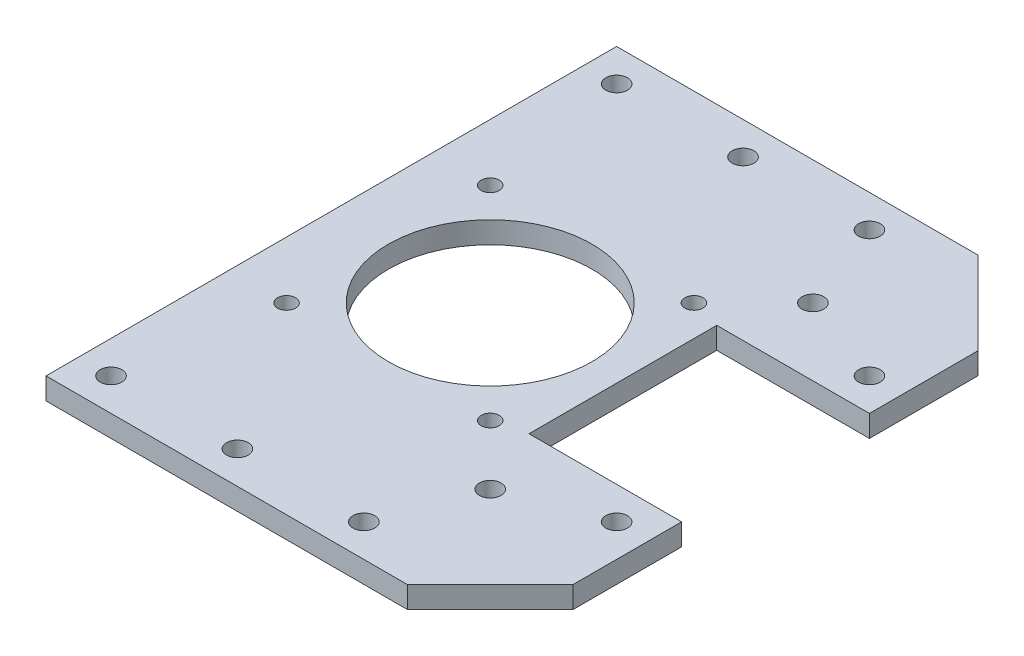
ISO-10303-21;
HEADER;
FILE_DESCRIPTION(('STEP AP214'),'2;1');
FILE_NAME('part.step','',(''),(''),'','','');
FILE_SCHEMA(('AUTOMOTIVE_DESIGN { 1 0 10303 214 1 1 1 1 }'));
ENDSEC;
DATA;
#1=APPLICATION_CONTEXT('core data for automotive mechanical design processes');
#2=APPLICATION_PROTOCOL_DEFINITION('international standard','automotive_design',2000,#1);
#3=PRODUCT_CONTEXT('',#1,'mechanical');
#4=PRODUCT('Part','Part','',(#3));
#5=PRODUCT_RELATED_PRODUCT_CATEGORY('part','',(#4));
#6=PRODUCT_DEFINITION_FORMATION('','',#4);
#7=PRODUCT_DEFINITION_CONTEXT('part definition',#1,'design');
#8=PRODUCT_DEFINITION('design','',#6,#7);
#9=PRODUCT_DEFINITION_SHAPE('','',#8);
#10=(LENGTH_UNIT() NAMED_UNIT(*) SI_UNIT(.MILLI.,.METRE.));
#11=(NAMED_UNIT(*) PLANE_ANGLE_UNIT() SI_UNIT($,.RADIAN.));
#12=(NAMED_UNIT(*) SI_UNIT($,.STERADIAN.) SOLID_ANGLE_UNIT());
#13=UNCERTAINTY_MEASURE_WITH_UNIT(LENGTH_MEASURE(1.E-05),#10,'distance_accuracy_value','');
#14=(GEOMETRIC_REPRESENTATION_CONTEXT(3) GLOBAL_UNCERTAINTY_ASSIGNED_CONTEXT((#13)) GLOBAL_UNIT_ASSIGNED_CONTEXT((#10,
#11,#12)) REPRESENTATION_CONTEXT('',''));
#15=CARTESIAN_POINT('',(0.,0.,0.));
#16=DIRECTION('',(0.,0.,1.));
#17=DIRECTION('',(1.,0.,0.));
#18=AXIS2_PLACEMENT_3D('',#15,#16,#17);
#19=CARTESIAN_POINT('',(0.,3.,0.));
#20=DIRECTION('',(0.,1.,0.));
#21=DIRECTION('',(0.,0.,1.));
#22=AXIS2_PLACEMENT_3D('',#19,#20,#21);
#23=PLANE('',#22);
#24=CARTESIAN_POINT('',(-14.1,3.,-14.1));
#25=DIRECTION('',(0.,1.,0.));
#26=DIRECTION('',(0.,0.,1.));
#27=AXIS2_PLACEMENT_3D('',#24,#25,#26);
#28=CIRCLE('',#27,1.25);
#29=CARTESIAN_POINT('',(-14.1,3.,-12.85));
#30=VERTEX_POINT('',#29);
#31=EDGE_CURVE('E292',#30,#30,#28,.T.);
#32=ORIENTED_EDGE('',*,*,#31,.F.);
#33=EDGE_LOOP('',(#32));
#34=FACE_BOUND('',#33,.T.);
#35=CARTESIAN_POINT('',(22.3377201986492,3.,22.3377201986492));
#36=DIRECTION('',(0.,1.,0.));
#37=DIRECTION('',(0.,0.,1.));
#38=AXIS2_PLACEMENT_3D('',#35,#36,#37);
#39=CIRCLE('',#38,1.5);
#40=CARTESIAN_POINT('',(22.3377201986492,3.,23.8377201986492));
#41=VERTEX_POINT('',#40);
#42=EDGE_CURVE('E280',#41,#41,#39,.T.);
#43=ORIENTED_EDGE('',*,*,#42,.F.);
#44=EDGE_LOOP('',(#43));
#45=FACE_BOUND('',#44,.T.);
#46=CARTESIAN_POINT('',(35.,3.,-17.5));
#47=DIRECTION('',(0.,1.,0.));
#48=DIRECTION('',(0.,0.,1.));
#49=AXIS2_PLACEMENT_3D('',#46,#47,#48);
#50=CIRCLE('',#49,1.5);
#51=CARTESIAN_POINT('',(35.,3.,-16.));
#52=VERTEX_POINT('',#51);
#53=EDGE_CURVE('E268',#52,#52,#50,.T.);
#54=ORIENTED_EDGE('',*,*,#53,.F.);
#55=EDGE_LOOP('',(#54));
#56=FACE_BOUND('',#55,.T.);
#57=CARTESIAN_POINT('',(17.5,3.,-35.));
#58=DIRECTION('',(0.,1.,0.));
#59=DIRECTION('',(0.,0.,1.));
#60=AXIS2_PLACEMENT_3D('',#57,#58,#59);
#61=CIRCLE('',#60,1.5);
#62=CARTESIAN_POINT('',(17.5,3.,-33.5));
#63=VERTEX_POINT('',#62);
#64=EDGE_CURVE('E256',#63,#63,#61,.T.);
#65=ORIENTED_EDGE('',*,*,#64,.F.);
#66=EDGE_LOOP('',(#65));
#67=FACE_BOUND('',#66,.T.);
#68=CARTESIAN_POINT('',(14.1,3.,-14.1));
#69=DIRECTION('',(0.,1.,0.));
#70=DIRECTION('',(0.,0.,1.));
#71=AXIS2_PLACEMENT_3D('',#68,#69,#70);
#72=CIRCLE('',#71,1.25);
#73=CARTESIAN_POINT('',(14.1,3.,-12.85));
#74=VERTEX_POINT('',#73);
#75=EDGE_CURVE('E244',#74,#74,#72,.T.);
#76=ORIENTED_EDGE('',*,*,#75,.F.);
#77=EDGE_LOOP('',(#76));
#78=FACE_BOUND('',#77,.T.);
#79=CARTESIAN_POINT('',(0.,3.,-34.9999999999999));
#80=DIRECTION('',(0.,1.,0.));
#81=DIRECTION('',(0.,0.,1.));
#82=AXIS2_PLACEMENT_3D('',#79,#80,#81);
#83=CIRCLE('',#82,1.5);
#84=CARTESIAN_POINT('',(0.,3.,-33.4999999999999));
#85=VERTEX_POINT('',#84);
#86=EDGE_CURVE('E232',#85,#85,#83,.T.);
#87=ORIENTED_EDGE('',*,*,#86,.F.);
#88=EDGE_LOOP('',(#87));
#89=FACE_BOUND('',#88,.T.);
#90=CARTESIAN_POINT('',(1.2490009027033E-13,3.,34.9999999999999));
#91=DIRECTION('',(0.,1.,0.));
#92=DIRECTION('',(0.,0.,-1.));
#93=AXIS2_PLACEMENT_3D('',#90,#91,#92);
#94=CIRCLE('',#93,1.49999999999987);
#95=CARTESIAN_POINT('',(1.2490009027033E-13,3.,33.5));
#96=VERTEX_POINT('',#95);
#97=EDGE_CURVE('E220',#96,#96,#94,.T.);
#98=ORIENTED_EDGE('',*,*,#97,.F.);
#99=EDGE_LOOP('',(#98));
#100=FACE_BOUND('',#99,.T.);
#101=DIRECTION('',(0.,0.,-1.));
#102=VECTOR('',#101,1.);
#103=CARTESIAN_POINT('',(39.5000000000003,3.,-13.0000000000003));
#104=LINE('',#103,#102);
#105=CARTESIAN_POINT('',(39.5000000000003,3.,-13.0000000000003));
#106=VERTEX_POINT('',#105);
#107=CARTESIAN_POINT('',(39.5000000000002,3.,-28.0315247468661));
#108=VERTEX_POINT('',#107);
#109=EDGE_CURVE('E170',#106,#108,#104,.T.);
#110=ORIENTED_EDGE('',*,*,#109,.T.);
#111=DIRECTION('',(-0.707106781186549,0.,-0.707106781186546));
#112=VECTOR('',#111,1.);
#113=CARTESIAN_POINT('',(39.5000000000002,3.,-28.0315247468661));
#114=LINE('',#113,#112);
#115=CARTESIAN_POINT('',(28.031524746866,3.,-39.5000000000003));
#116=VERTEX_POINT('',#115);
#117=EDGE_CURVE('E107',#108,#116,#114,.T.);
#118=ORIENTED_EDGE('',*,*,#117,.T.);
#119=DIRECTION('',(-1.,0.,0.));
#120=VECTOR('',#119,1.);
#121=CARTESIAN_POINT('',(28.031524746866,3.,-39.5000000000003));
#122=LINE('',#121,#120);
#123=CARTESIAN_POINT('',(-21.9999999999998,3.,-39.5000000000002));
#124=VERTEX_POINT('',#123);
#125=EDGE_CURVE('E191',#116,#124,#122,.T.);
#126=ORIENTED_EDGE('',*,*,#125,.T.);
#127=DIRECTION('',(0.,0.,1.));
#128=VECTOR('',#127,1.);
#129=CARTESIAN_POINT('',(-21.9999999999998,3.,-39.5000000000002));
#130=LINE('',#129,#128);
#131=CARTESIAN_POINT('',(-21.9999999999997,3.,39.4999999999998));
#132=VERTEX_POINT('',#131);
#133=EDGE_CURVE('E209',#124,#132,#130,.T.);
#134=ORIENTED_EDGE('',*,*,#133,.T.);
#135=DIRECTION('',(1.,0.,0.));
#136=VECTOR('',#135,1.);
#137=CARTESIAN_POINT('',(-21.9999999999997,3.,39.4999999999998));
#138=LINE('',#137,#136);
#139=CARTESIAN_POINT('',(28.031524746866,3.,39.4999999999998));
#140=VERTEX_POINT('',#139);
#141=EDGE_CURVE('E206',#132,#140,#138,.T.);
#142=ORIENTED_EDGE('',*,*,#141,.T.);
#143=DIRECTION('',(0.707106781186547,0.,-0.707106781186548));
#144=VECTOR('',#143,1.);
#145=CARTESIAN_POINT('',(28.031524746866,3.,39.4999999999998));
#146=LINE('',#145,#144);
#147=CARTESIAN_POINT('',(39.5000000000003,3.,28.0315247468655));
#148=VERTEX_POINT('',#147);
#149=EDGE_CURVE('E208',#140,#148,#146,.T.);
#150=ORIENTED_EDGE('',*,*,#149,.T.);
#151=DIRECTION('',(0.,0.,-1.));
#152=VECTOR('',#151,1.);
#153=CARTESIAN_POINT('',(39.5000000000003,3.,28.0315247468655));
#154=LINE('',#153,#152);
#155=CARTESIAN_POINT('',(39.5000000000003,3.,12.9999999999997));
#156=VERTEX_POINT('',#155);
#157=EDGE_CURVE('E132',#148,#156,#154,.T.);
#158=ORIENTED_EDGE('',*,*,#157,.T.);
#159=DIRECTION('',(-1.,0.,0.));
#160=VECTOR('',#159,1.);
#161=CARTESIAN_POINT('',(18.3705497837258,3.,12.9999999999997));
#162=LINE('',#161,#160);
#163=CARTESIAN_POINT('',(18.3705497837258,3.,12.9999999999997));
#164=VERTEX_POINT('',#163);
#165=EDGE_CURVE('E126',#156,#164,#162,.T.);
#166=ORIENTED_EDGE('',*,*,#165,.T.);
#167=DIRECTION('',(0.,0.,-1.));
#168=VECTOR('',#167,1.);
#169=CARTESIAN_POINT('',(18.3705497837256,3.,-12.9912624730496));
#170=LINE('',#169,#168);
#171=CARTESIAN_POINT('',(18.3705497837256,3.,-12.9912624730496));
#172=VERTEX_POINT('',#171);
#173=EDGE_CURVE('E130',#164,#172,#170,.T.);
#174=ORIENTED_EDGE('',*,*,#173,.T.);
#175=DIRECTION('',(0.999999914499115,0.,-0.000413523594520642));
#176=VECTOR('',#175,1.);
#177=CARTESIAN_POINT('',(39.5000000000003,3.,-13.0000000000003));
#178=LINE('',#177,#176);
#179=EDGE_CURVE('E58',#172,#106,#178,.T.);
#180=ORIENTED_EDGE('',*,*,#179,.T.);
#181=EDGE_LOOP('',(#110,#118,#126,#134,#142,#150,#158,#166,#174,#180));
#182=FACE_BOUND('',#181,.T.);
#183=CARTESIAN_POINT('',(-14.1,3.,14.1));
#184=DIRECTION('',(0.,1.,0.));
#185=DIRECTION('',(0.,0.,1.));
#186=AXIS2_PLACEMENT_3D('',#183,#184,#185);
#187=CIRCLE('',#186,1.25);
#188=CARTESIAN_POINT('',(-14.1,3.,15.35));
#189=VERTEX_POINT('',#188);
#190=EDGE_CURVE('E154',#189,#189,#187,.T.);
#191=ORIENTED_EDGE('',*,*,#190,.F.);
#192=EDGE_LOOP('',(#191));
#193=FACE_BOUND('',#192,.T.);
#194=CARTESIAN_POINT('',(-17.4999999999999,3.,34.9999999999998));
#195=DIRECTION('',(0.,1.,0.));
#196=DIRECTION('',(0.,0.,-1.));
#197=AXIS2_PLACEMENT_3D('',#194,#195,#196);
#198=CIRCLE('',#197,1.49999999999987);
#199=CARTESIAN_POINT('',(-17.4999999999999,3.,33.4999999999999));
#200=VERTEX_POINT('',#199);
#201=EDGE_CURVE('E226',#200,#200,#198,.T.);
#202=ORIENTED_EDGE('',*,*,#201,.F.);
#203=EDGE_LOOP('',(#202));
#204=FACE_BOUND('',#203,.T.);
#205=CARTESIAN_POINT('',(-17.5,3.,-34.9999999999998));
#206=DIRECTION('',(0.,1.,0.));
#207=DIRECTION('',(0.,0.,1.));
#208=AXIS2_PLACEMENT_3D('',#205,#206,#207);
#209=CIRCLE('',#208,1.5);
#210=CARTESIAN_POINT('',(-17.5,3.,-33.4999999999998));
#211=VERTEX_POINT('',#210);
#212=EDGE_CURVE('E238',#211,#211,#209,.T.);
#213=ORIENTED_EDGE('',*,*,#212,.F.);
#214=EDGE_LOOP('',(#213));
#215=FACE_BOUND('',#214,.T.);
#216=CARTESIAN_POINT('',(0.,3.,0.));
#217=DIRECTION('',(0.,1.,0.));
#218=DIRECTION('',(0.,0.,1.));
#219=AXIS2_PLACEMENT_3D('',#216,#217,#218);
#220=CIRCLE('',#219,14.1);
#221=CARTESIAN_POINT('',(0.,3.,14.1));
#222=VERTEX_POINT('',#221);
#223=EDGE_CURVE('E250',#222,#222,#220,.T.);
#224=ORIENTED_EDGE('',*,*,#223,.F.);
#225=EDGE_LOOP('',(#224));
#226=FACE_BOUND('',#225,.T.);
#227=CARTESIAN_POINT('',(22.3377201986492,3.,-22.3377201986493));
#228=DIRECTION('',(0.,1.,0.));
#229=DIRECTION('',(0.,0.,1.));
#230=AXIS2_PLACEMENT_3D('',#227,#228,#229);
#231=CIRCLE('',#230,1.5);
#232=CARTESIAN_POINT('',(22.3377201986492,3.,-20.8377201986493));
#233=VERTEX_POINT('',#232);
#234=EDGE_CURVE('E262',#233,#233,#231,.T.);
#235=ORIENTED_EDGE('',*,*,#234,.F.);
#236=EDGE_LOOP('',(#235));
#237=FACE_BOUND('',#236,.T.);
#238=CARTESIAN_POINT('',(17.5,3.,35.));
#239=DIRECTION('',(0.,1.,0.));
#240=DIRECTION('',(0.,0.,1.));
#241=AXIS2_PLACEMENT_3D('',#238,#239,#240);
#242=CIRCLE('',#241,1.5);
#243=CARTESIAN_POINT('',(17.5,3.,36.5));
#244=VERTEX_POINT('',#243);
#245=EDGE_CURVE('E274',#244,#244,#242,.T.);
#246=ORIENTED_EDGE('',*,*,#245,.F.);
#247=EDGE_LOOP('',(#246));
#248=FACE_BOUND('',#247,.T.);
#249=CARTESIAN_POINT('',(35.,3.,17.5));
#250=DIRECTION('',(0.,1.,0.));
#251=DIRECTION('',(0.,0.,1.));
#252=AXIS2_PLACEMENT_3D('',#249,#250,#251);
#253=CIRCLE('',#252,1.5);
#254=CARTESIAN_POINT('',(35.,3.,19.));
#255=VERTEX_POINT('',#254);
#256=EDGE_CURVE('E286',#255,#255,#253,.T.);
#257=ORIENTED_EDGE('',*,*,#256,.F.);
#258=EDGE_LOOP('',(#257));
#259=FACE_BOUND('',#258,.T.);
#260=CARTESIAN_POINT('',(14.1,3.,14.1));
#261=DIRECTION('',(0.,1.,0.));
#262=DIRECTION('',(0.,0.,1.));
#263=AXIS2_PLACEMENT_3D('',#260,#261,#262);
#264=CIRCLE('',#263,1.25);
#265=CARTESIAN_POINT('',(14.1,3.,15.35));
#266=VERTEX_POINT('',#265);
#267=EDGE_CURVE('E298',#266,#266,#264,.T.);
#268=ORIENTED_EDGE('',*,*,#267,.F.);
#269=EDGE_LOOP('',(#268));
#270=FACE_BOUND('',#269,.T.);
#271=ADVANCED_FACE('F41',(#34,#45,#56,#67,#78,#89,#100,#182,#193,#204,#215,#226,#237,#248,#259,
#270),#23,.T.);
#272=CARTESIAN_POINT('',(0.,0.,0.));
#273=DIRECTION('',(0.,1.,0.));
#274=DIRECTION('',(0.,0.,1.));
#275=AXIS2_PLACEMENT_3D('',#272,#273,#274);
#276=PLANE('',#275);
#277=DIRECTION('',(0.,0.,-1.));
#278=VECTOR('',#277,1.);
#279=CARTESIAN_POINT('',(39.5000000000003,0.,-13.0000000000003));
#280=LINE('',#279,#278);
#281=CARTESIAN_POINT('',(39.5000000000003,0.,-13.0000000000003));
#282=VERTEX_POINT('',#281);
#283=CARTESIAN_POINT('',(39.5000000000002,0.,-28.0315247468661));
#284=VERTEX_POINT('',#283);
#285=EDGE_CURVE('E150',#282,#284,#280,.T.);
#286=ORIENTED_EDGE('',*,*,#285,.F.);
#287=DIRECTION('',(0.999999914499115,0.,-0.000413523594520642));
#288=VECTOR('',#287,1.);
#289=CARTESIAN_POINT('',(39.5000000000003,0.,-13.0000000000003));
#290=LINE('',#289,#288);
#291=CARTESIAN_POINT('',(18.3705497837256,0.,-12.9912624730496));
#292=VERTEX_POINT('',#291);
#293=EDGE_CURVE('E99',#292,#282,#290,.T.);
#294=ORIENTED_EDGE('',*,*,#293,.F.);
#295=DIRECTION('',(0.,0.,-1.));
#296=VECTOR('',#295,1.);
#297=CARTESIAN_POINT('',(18.3705497837256,0.,-12.9912624730496));
#298=LINE('',#297,#296);
#299=CARTESIAN_POINT('',(18.3705497837258,0.,12.9999999999997));
#300=VERTEX_POINT('',#299);
#301=EDGE_CURVE('E93',#300,#292,#298,.T.);
#302=ORIENTED_EDGE('',*,*,#301,.F.);
#303=DIRECTION('',(-1.,0.,0.));
#304=VECTOR('',#303,1.);
#305=CARTESIAN_POINT('',(18.3705497837258,0.,12.9999999999997));
#306=LINE('',#305,#304);
#307=CARTESIAN_POINT('',(39.5000000000003,0.,12.9999999999997));
#308=VERTEX_POINT('',#307);
#309=EDGE_CURVE('E140',#308,#300,#306,.T.);
#310=ORIENTED_EDGE('',*,*,#309,.F.);
#311=DIRECTION('',(0.,0.,-1.));
#312=VECTOR('',#311,1.);
#313=CARTESIAN_POINT('',(39.5000000000003,0.,28.0315247468655));
#314=LINE('',#313,#312);
#315=CARTESIAN_POINT('',(39.5000000000003,0.,28.0315247468655));
#316=VERTEX_POINT('',#315);
#317=EDGE_CURVE('E165',#316,#308,#314,.T.);
#318=ORIENTED_EDGE('',*,*,#317,.F.);
#319=DIRECTION('',(0.707106781186547,0.,-0.707106781186548));
#320=VECTOR('',#319,1.);
#321=CARTESIAN_POINT('',(28.031524746866,0.,39.4999999999998));
#322=LINE('',#321,#320);
#323=CARTESIAN_POINT('',(28.031524746866,0.,39.4999999999998));
#324=VERTEX_POINT('',#323);
#325=EDGE_CURVE('E163',#324,#316,#322,.T.);
#326=ORIENTED_EDGE('',*,*,#325,.F.);
#327=DIRECTION('',(1.,0.,0.));
#328=VECTOR('',#327,1.);
#329=CARTESIAN_POINT('',(-21.9999999999997,0.,39.4999999999998));
#330=LINE('',#329,#328);
#331=CARTESIAN_POINT('',(-21.9999999999997,0.,39.4999999999998));
#332=VERTEX_POINT('',#331);
#333=EDGE_CURVE('E161',#332,#324,#330,.T.);
#334=ORIENTED_EDGE('',*,*,#333,.F.);
#335=DIRECTION('',(0.,0.,1.));
#336=VECTOR('',#335,1.);
#337=CARTESIAN_POINT('',(-21.9999999999998,0.,-30.5000000000002));
#338=LINE('',#337,#336);
#339=CARTESIAN_POINT('',(-21.9999999999998,0.,-39.5000000000002));
#340=VERTEX_POINT('',#339);
#341=EDGE_CURVE('E159',#340,#332,#338,.T.);
#342=ORIENTED_EDGE('',*,*,#341,.F.);
#343=DIRECTION('',(-1.,0.,0.));
#344=VECTOR('',#343,1.);
#345=CARTESIAN_POINT('',(28.031524746866,0.,-39.5000000000003));
#346=LINE('',#345,#344);
#347=CARTESIAN_POINT('',(28.031524746866,0.,-39.5000000000003));
#348=VERTEX_POINT('',#347);
#349=EDGE_CURVE('E156',#348,#340,#346,.T.);
#350=ORIENTED_EDGE('',*,*,#349,.F.);
#351=DIRECTION('',(-0.707106781186549,0.,-0.707106781186546));
#352=VECTOR('',#351,1.);
#353=CARTESIAN_POINT('',(39.5000000000002,0.,-28.0315247468661));
#354=LINE('',#353,#352);
#355=EDGE_CURVE('E153',#284,#348,#354,.T.);
#356=ORIENTED_EDGE('',*,*,#355,.F.);
#357=EDGE_LOOP('',(#286,#294,#302,#310,#318,#326,#334,#342,#350,#356));
#358=FACE_BOUND('',#357,.T.);
#359=CARTESIAN_POINT('',(-14.1,0.,14.1));
#360=DIRECTION('',(0.,1.,0.));
#361=DIRECTION('',(0.,0.,1.));
#362=AXIS2_PLACEMENT_3D('',#359,#360,#361);
#363=CIRCLE('',#362,1.25);
#364=CARTESIAN_POINT('',(-14.1,0.,15.35));
#365=VERTEX_POINT('',#364);
#366=EDGE_CURVE('E217',#365,#365,#363,.T.);
#367=ORIENTED_EDGE('',*,*,#366,.T.);
#368=EDGE_LOOP('',(#367));
#369=FACE_BOUND('',#368,.T.);
#370=CARTESIAN_POINT('',(1.2490009027033E-13,0.,34.9999999999999));
#371=DIRECTION('',(0.,1.,0.));
#372=DIRECTION('',(0.,0.,-1.));
#373=AXIS2_PLACEMENT_3D('',#370,#371,#372);
#374=CIRCLE('',#373,1.49999999999987);
#375=CARTESIAN_POINT('',(1.2490009027033E-13,0.,33.5));
#376=VERTEX_POINT('',#375);
#377=EDGE_CURVE('E223',#376,#376,#374,.T.);
#378=ORIENTED_EDGE('',*,*,#377,.T.);
#379=EDGE_LOOP('',(#378));
#380=FACE_BOUND('',#379,.T.);
#381=CARTESIAN_POINT('',(-17.4999999999999,0.,34.9999999999998));
#382=DIRECTION('',(0.,1.,0.));
#383=DIRECTION('',(0.,0.,-1.));
#384=AXIS2_PLACEMENT_3D('',#381,#382,#383);
#385=CIRCLE('',#384,1.49999999999987);
#386=CARTESIAN_POINT('',(-17.4999999999999,0.,33.4999999999999));
#387=VERTEX_POINT('',#386);
#388=EDGE_CURVE('E229',#387,#387,#385,.T.);
#389=ORIENTED_EDGE('',*,*,#388,.T.);
#390=EDGE_LOOP('',(#389));
#391=FACE_BOUND('',#390,.T.);
#392=CARTESIAN_POINT('',(0.,0.,-34.9999999999999));
#393=DIRECTION('',(0.,1.,0.));
#394=DIRECTION('',(0.,0.,1.));
#395=AXIS2_PLACEMENT_3D('',#392,#393,#394);
#396=CIRCLE('',#395,1.5);
#397=CARTESIAN_POINT('',(0.,0.,-33.4999999999999));
#398=VERTEX_POINT('',#397);
#399=EDGE_CURVE('E235',#398,#398,#396,.T.);
#400=ORIENTED_EDGE('',*,*,#399,.T.);
#401=EDGE_LOOP('',(#400));
#402=FACE_BOUND('',#401,.T.);
#403=CARTESIAN_POINT('',(-17.5,0.,-34.9999999999998));
#404=DIRECTION('',(0.,1.,0.));
#405=DIRECTION('',(0.,0.,1.));
#406=AXIS2_PLACEMENT_3D('',#403,#404,#405);
#407=CIRCLE('',#406,1.5);
#408=CARTESIAN_POINT('',(-17.5,0.,-33.4999999999998));
#409=VERTEX_POINT('',#408);
#410=EDGE_CURVE('E241',#409,#409,#407,.T.);
#411=ORIENTED_EDGE('',*,*,#410,.T.);
#412=EDGE_LOOP('',(#411));
#413=FACE_BOUND('',#412,.T.);
#414=CARTESIAN_POINT('',(14.1,0.,-14.1));
#415=DIRECTION('',(0.,1.,0.));
#416=DIRECTION('',(0.,0.,1.));
#417=AXIS2_PLACEMENT_3D('',#414,#415,#416);
#418=CIRCLE('',#417,1.25);
#419=CARTESIAN_POINT('',(14.1,0.,-12.85));
#420=VERTEX_POINT('',#419);
#421=EDGE_CURVE('E247',#420,#420,#418,.T.);
#422=ORIENTED_EDGE('',*,*,#421,.T.);
#423=EDGE_LOOP('',(#422));
#424=FACE_BOUND('',#423,.T.);
#425=CARTESIAN_POINT('',(0.,0.,0.));
#426=DIRECTION('',(0.,1.,0.));
#427=DIRECTION('',(0.,0.,1.));
#428=AXIS2_PLACEMENT_3D('',#425,#426,#427);
#429=CIRCLE('',#428,14.1);
#430=CARTESIAN_POINT('',(0.,0.,14.1));
#431=VERTEX_POINT('',#430);
#432=EDGE_CURVE('E253',#431,#431,#429,.T.);
#433=ORIENTED_EDGE('',*,*,#432,.T.);
#434=EDGE_LOOP('',(#433));
#435=FACE_BOUND('',#434,.T.);
#436=CARTESIAN_POINT('',(17.5,0.,-35.));
#437=DIRECTION('',(0.,1.,0.));
#438=DIRECTION('',(0.,0.,1.));
#439=AXIS2_PLACEMENT_3D('',#436,#437,#438);
#440=CIRCLE('',#439,1.5);
#441=CARTESIAN_POINT('',(17.5,0.,-33.5));
#442=VERTEX_POINT('',#441);
#443=EDGE_CURVE('E259',#442,#442,#440,.T.);
#444=ORIENTED_EDGE('',*,*,#443,.T.);
#445=EDGE_LOOP('',(#444));
#446=FACE_BOUND('',#445,.T.);
#447=CARTESIAN_POINT('',(22.3377201986492,0.,-22.3377201986493));
#448=DIRECTION('',(0.,1.,0.));
#449=DIRECTION('',(0.,0.,1.));
#450=AXIS2_PLACEMENT_3D('',#447,#448,#449);
#451=CIRCLE('',#450,1.5);
#452=CARTESIAN_POINT('',(22.3377201986492,0.,-20.8377201986493));
#453=VERTEX_POINT('',#452);
#454=EDGE_CURVE('E265',#453,#453,#451,.T.);
#455=ORIENTED_EDGE('',*,*,#454,.T.);
#456=EDGE_LOOP('',(#455));
#457=FACE_BOUND('',#456,.T.);
#458=CARTESIAN_POINT('',(35.,0.,-17.5));
#459=DIRECTION('',(0.,1.,0.));
#460=DIRECTION('',(0.,0.,1.));
#461=AXIS2_PLACEMENT_3D('',#458,#459,#460);
#462=CIRCLE('',#461,1.5);
#463=CARTESIAN_POINT('',(35.,0.,-16.));
#464=VERTEX_POINT('',#463);
#465=EDGE_CURVE('E271',#464,#464,#462,.T.);
#466=ORIENTED_EDGE('',*,*,#465,.T.);
#467=EDGE_LOOP('',(#466));
#468=FACE_BOUND('',#467,.T.);
#469=CARTESIAN_POINT('',(17.5,0.,35.));
#470=DIRECTION('',(0.,1.,0.));
#471=DIRECTION('',(0.,0.,1.));
#472=AXIS2_PLACEMENT_3D('',#469,#470,#471);
#473=CIRCLE('',#472,1.5);
#474=CARTESIAN_POINT('',(17.5,0.,36.5));
#475=VERTEX_POINT('',#474);
#476=EDGE_CURVE('E277',#475,#475,#473,.T.);
#477=ORIENTED_EDGE('',*,*,#476,.T.);
#478=EDGE_LOOP('',(#477));
#479=FACE_BOUND('',#478,.T.);
#480=CARTESIAN_POINT('',(22.3377201986492,0.,22.3377201986492));
#481=DIRECTION('',(0.,1.,0.));
#482=DIRECTION('',(0.,0.,1.));
#483=AXIS2_PLACEMENT_3D('',#480,#481,#482);
#484=CIRCLE('',#483,1.5);
#485=CARTESIAN_POINT('',(22.3377201986492,0.,23.8377201986492));
#486=VERTEX_POINT('',#485);
#487=EDGE_CURVE('E283',#486,#486,#484,.T.);
#488=ORIENTED_EDGE('',*,*,#487,.T.);
#489=EDGE_LOOP('',(#488));
#490=FACE_BOUND('',#489,.T.);
#491=CARTESIAN_POINT('',(35.,0.,17.5));
#492=DIRECTION('',(0.,1.,0.));
#493=DIRECTION('',(0.,0.,1.));
#494=AXIS2_PLACEMENT_3D('',#491,#492,#493);
#495=CIRCLE('',#494,1.5);
#496=CARTESIAN_POINT('',(35.,0.,19.));
#497=VERTEX_POINT('',#496);
#498=EDGE_CURVE('E289',#497,#497,#495,.T.);
#499=ORIENTED_EDGE('',*,*,#498,.T.);
#500=EDGE_LOOP('',(#499));
#501=FACE_BOUND('',#500,.T.);
#502=CARTESIAN_POINT('',(-14.1,0.,-14.1));
#503=DIRECTION('',(0.,1.,0.));
#504=DIRECTION('',(0.,0.,1.));
#505=AXIS2_PLACEMENT_3D('',#502,#503,#504);
#506=CIRCLE('',#505,1.25);
#507=CARTESIAN_POINT('',(-14.1,0.,-12.85));
#508=VERTEX_POINT('',#507);
#509=EDGE_CURVE('E295',#508,#508,#506,.T.);
#510=ORIENTED_EDGE('',*,*,#509,.T.);
#511=EDGE_LOOP('',(#510));
#512=FACE_BOUND('',#511,.T.);
#513=CARTESIAN_POINT('',(14.1,0.,14.1));
#514=DIRECTION('',(0.,1.,0.));
#515=DIRECTION('',(0.,0.,1.));
#516=AXIS2_PLACEMENT_3D('',#513,#514,#515);
#517=CIRCLE('',#516,1.25);
#518=CARTESIAN_POINT('',(14.1,0.,15.35));
#519=VERTEX_POINT('',#518);
#520=EDGE_CURVE('E301',#519,#519,#517,.T.);
#521=ORIENTED_EDGE('',*,*,#520,.T.);
#522=EDGE_LOOP('',(#521));
#523=FACE_BOUND('',#522,.T.);
#524=ADVANCED_FACE('F194',(#358,#369,#380,#391,#402,#413,#424,#435,#446,#457,#468,#479,#490,
#501,#512,#523),#276,.F.);
#525=CARTESIAN_POINT('',(39.5000000000003,3.,-13.0000000000003));
#526=DIRECTION('',(-1.,0.,0.));
#527=DIRECTION('',(0.,0.,1.));
#528=AXIS2_PLACEMENT_3D('',#525,#526,#527);
#529=PLANE('',#528);
#530=ORIENTED_EDGE('',*,*,#285,.T.);
#531=DIRECTION('',(0.,-1.,0.));
#532=VECTOR('',#531,1.);
#533=CARTESIAN_POINT('',(39.5000000000002,3.,-28.0315247468661));
#534=LINE('',#533,#532);
#535=EDGE_CURVE('E11',#108,#284,#534,.T.);
#536=ORIENTED_EDGE('',*,*,#535,.F.);
#537=ORIENTED_EDGE('',*,*,#109,.F.);
#538=DIRECTION('',(0.,-1.,0.));
#539=VECTOR('',#538,1.);
#540=CARTESIAN_POINT('',(39.5000000000003,3.,-13.0000000000003));
#541=LINE('',#540,#539);
#542=EDGE_CURVE('E146',#106,#282,#541,.T.);
#543=ORIENTED_EDGE('',*,*,#542,.T.);
#544=EDGE_LOOP('',(#530,#536,#537,#543));
#545=FACE_BOUND('',#544,.T.);
#546=ADVANCED_FACE('F43',(#545),#529,.F.);
#547=CARTESIAN_POINT('',(39.5000000000002,3.,-28.0315247468661));
#548=DIRECTION('',(-0.707106781186546,0.,0.707106781186548));
#549=DIRECTION('',(0.707106781186549,0.,0.707106781186546));
#550=AXIS2_PLACEMENT_3D('',#547,#548,#549);
#551=PLANE('',#550);
#552=ORIENTED_EDGE('',*,*,#355,.T.);
#553=DIRECTION('',(0.,-1.,0.));
#554=VECTOR('',#553,1.);
#555=CARTESIAN_POINT('',(28.031524746866,3.,-39.5000000000003));
#556=LINE('',#555,#554);
#557=EDGE_CURVE('E50',#116,#348,#556,.T.);
#558=ORIENTED_EDGE('',*,*,#557,.F.);
#559=ORIENTED_EDGE('',*,*,#117,.F.);
#560=ORIENTED_EDGE('',*,*,#535,.T.);
#561=EDGE_LOOP('',(#552,#558,#559,#560));
#562=FACE_BOUND('',#561,.T.);
#563=ADVANCED_FACE('F343',(#562),#551,.F.);
#564=CARTESIAN_POINT('',(28.031524746866,3.,-39.5000000000003));
#565=DIRECTION('',(0.,0.,1.));
#566=DIRECTION('',(1.,0.,0.));
#567=AXIS2_PLACEMENT_3D('',#564,#565,#566);
#568=PLANE('',#567);
#569=ORIENTED_EDGE('',*,*,#349,.T.);
#570=DIRECTION('',(0.,-1.,0.));
#571=VECTOR('',#570,1.);
#572=CARTESIAN_POINT('',(-21.9999999999998,3.,-39.5000000000002));
#573=LINE('',#572,#571);
#574=EDGE_CURVE('E183',#124,#340,#573,.T.);
#575=ORIENTED_EDGE('',*,*,#574,.F.);
#576=ORIENTED_EDGE('',*,*,#125,.F.);
#577=ORIENTED_EDGE('',*,*,#557,.T.);
#578=EDGE_LOOP('',(#569,#575,#576,#577));
#579=FACE_BOUND('',#578,.T.);
#580=ADVANCED_FACE('F189',(#579),#568,.F.);
#581=CARTESIAN_POINT('',(-21.9999999999998,3.,-30.5000000000002));
#582=DIRECTION('',(1.,0.,0.));
#583=DIRECTION('',(0.,0.,-1.));
#584=AXIS2_PLACEMENT_3D('',#581,#582,#583);
#585=PLANE('',#584);
#586=ORIENTED_EDGE('',*,*,#341,.T.);
#587=DIRECTION('',(0.,-1.,0.));
#588=VECTOR('',#587,1.);
#589=CARTESIAN_POINT('',(-21.9999999999997,3.,39.4999999999998));
#590=LINE('',#589,#588);
#591=EDGE_CURVE('E180',#132,#332,#590,.T.);
#592=ORIENTED_EDGE('',*,*,#591,.F.);
#593=ORIENTED_EDGE('',*,*,#133,.F.);
#594=ORIENTED_EDGE('',*,*,#574,.T.);
#595=EDGE_LOOP('',(#586,#592,#593,#594));
#596=FACE_BOUND('',#595,.T.);
#597=ADVANCED_FACE('F200',(#596),#585,.F.);
#598=CARTESIAN_POINT('',(-21.9999999999997,3.,39.4999999999998));
#599=DIRECTION('',(0.,0.,-1.));
#600=DIRECTION('',(-1.,0.,0.));
#601=AXIS2_PLACEMENT_3D('',#598,#599,#600);
#602=PLANE('',#601);
#603=ORIENTED_EDGE('',*,*,#333,.T.);
#604=DIRECTION('',(0.,-1.,0.));
#605=VECTOR('',#604,1.);
#606=CARTESIAN_POINT('',(28.031524746866,3.,39.4999999999998));
#607=LINE('',#606,#605);
#608=EDGE_CURVE('E177',#140,#324,#607,.T.);
#609=ORIENTED_EDGE('',*,*,#608,.F.);
#610=ORIENTED_EDGE('',*,*,#141,.F.);
#611=ORIENTED_EDGE('',*,*,#591,.T.);
#612=EDGE_LOOP('',(#603,#609,#610,#611));
#613=FACE_BOUND('',#612,.T.);
#614=ADVANCED_FACE('F204',(#613),#602,.F.);
#615=CARTESIAN_POINT('',(28.031524746866,3.,39.4999999999998));
#616=DIRECTION('',(-0.707106781186548,0.,-0.707106781186547));
#617=DIRECTION('',(-0.707106781186547,0.,0.707106781186548));
#618=AXIS2_PLACEMENT_3D('',#615,#616,#617);
#619=PLANE('',#618);
#620=ORIENTED_EDGE('',*,*,#325,.T.);
#621=DIRECTION('',(0.,-1.,0.));
#622=VECTOR('',#621,1.);
#623=CARTESIAN_POINT('',(39.5000000000003,3.,28.0315247468655));
#624=LINE('',#623,#622);
#625=EDGE_CURVE('E174',#148,#316,#624,.T.);
#626=ORIENTED_EDGE('',*,*,#625,.F.);
#627=ORIENTED_EDGE('',*,*,#149,.F.);
#628=ORIENTED_EDGE('',*,*,#608,.T.);
#629=EDGE_LOOP('',(#620,#626,#627,#628));
#630=FACE_BOUND('',#629,.T.);
#631=ADVANCED_FACE('F333',(#630),#619,.F.);
#632=CARTESIAN_POINT('',(39.5000000000003,3.,28.0315247468655));
#633=DIRECTION('',(-1.,0.,0.));
#634=DIRECTION('',(0.,0.,1.));
#635=AXIS2_PLACEMENT_3D('',#632,#633,#634);
#636=PLANE('',#635);
#637=ORIENTED_EDGE('',*,*,#317,.T.);
#638=DIRECTION('',(0.,-1.,0.));
#639=VECTOR('',#638,1.);
#640=CARTESIAN_POINT('',(39.5000000000003,3.,12.9999999999997));
#641=LINE('',#640,#639);
#642=EDGE_CURVE('E141',#156,#308,#641,.T.);
#643=ORIENTED_EDGE('',*,*,#642,.F.);
#644=ORIENTED_EDGE('',*,*,#157,.F.);
#645=ORIENTED_EDGE('',*,*,#625,.T.);
#646=EDGE_LOOP('',(#637,#643,#644,#645));
#647=FACE_BOUND('',#646,.T.);
#648=ADVANCED_FACE('F330',(#647),#636,.F.);
#649=CARTESIAN_POINT('',(18.3705497837258,3.,12.9999999999997));
#650=DIRECTION('',(0.,0.,1.));
#651=DIRECTION('',(1.,0.,0.));
#652=AXIS2_PLACEMENT_3D('',#649,#650,#651);
#653=PLANE('',#652);
#654=ORIENTED_EDGE('',*,*,#309,.T.);
#655=DIRECTION('',(0.,-1.,0.));
#656=VECTOR('',#655,1.);
#657=CARTESIAN_POINT('',(18.3705497837258,3.,12.9999999999997));
#658=LINE('',#657,#656);
#659=EDGE_CURVE('E137',#164,#300,#658,.T.);
#660=ORIENTED_EDGE('',*,*,#659,.F.);
#661=ORIENTED_EDGE('',*,*,#165,.F.);
#662=ORIENTED_EDGE('',*,*,#642,.T.);
#663=EDGE_LOOP('',(#654,#660,#661,#662));
#664=FACE_BOUND('',#663,.T.);
#665=ADVANCED_FACE('F138',(#664),#653,.F.);
#666=CARTESIAN_POINT('',(18.3705497837256,3.,-12.9912624730496));
#667=DIRECTION('',(-1.,0.,0.));
#668=DIRECTION('',(0.,0.,1.));
#669=AXIS2_PLACEMENT_3D('',#666,#667,#668);
#670=PLANE('',#669);
#671=ORIENTED_EDGE('',*,*,#301,.T.);
#672=DIRECTION('',(0.,-1.,0.));
#673=VECTOR('',#672,1.);
#674=CARTESIAN_POINT('',(18.3705497837256,3.,-12.9912624730496));
#675=LINE('',#674,#673);
#676=EDGE_CURVE('E142',#172,#292,#675,.T.);
#677=ORIENTED_EDGE('',*,*,#676,.F.);
#678=ORIENTED_EDGE('',*,*,#173,.F.);
#679=ORIENTED_EDGE('',*,*,#659,.T.);
#680=EDGE_LOOP('',(#671,#677,#678,#679));
#681=FACE_BOUND('',#680,.T.);
#682=ADVANCED_FACE('F144',(#681),#670,.F.);
#683=CARTESIAN_POINT('',(39.5000000000003,3.,-13.0000000000003));
#684=DIRECTION('',(-0.000413523594520642,0.,-0.999999914499115));
#685=DIRECTION('',(-0.999999914499115,0.,0.000413523594520642));
#686=AXIS2_PLACEMENT_3D('',#683,#684,#685);
#687=PLANE('',#686);
#688=ORIENTED_EDGE('',*,*,#293,.T.);
#689=ORIENTED_EDGE('',*,*,#542,.F.);
#690=ORIENTED_EDGE('',*,*,#179,.F.);
#691=ORIENTED_EDGE('',*,*,#676,.T.);
#692=EDGE_LOOP('',(#688,#689,#690,#691));
#693=FACE_BOUND('',#692,.T.);
#694=ADVANCED_FACE('F323',(#693),#687,.F.);
#695=CARTESIAN_POINT('',(-14.1,3.,14.1));
#696=DIRECTION('',(0.,-1.,0.));
#697=DIRECTION('',(0.,0.,-1.));
#698=AXIS2_PLACEMENT_3D('',#695,#696,#697);
#699=CYLINDRICAL_SURFACE('',#698,1.25);
#700=ORIENTED_EDGE('',*,*,#190,.T.);
#701=EDGE_LOOP('',(#700));
#702=FACE_BOUND('',#701,.T.);
#703=ORIENTED_EDGE('',*,*,#366,.F.);
#704=EDGE_LOOP('',(#703));
#705=FACE_BOUND('',#704,.T.);
#706=ADVANCED_FACE('F320',(#702,#705),#699,.F.);
#707=CARTESIAN_POINT('',(1.2490009027033E-13,3.,34.9999999999999));
#708=DIRECTION('',(0.,-1.,0.));
#709=DIRECTION('',(0.,0.,-1.));
#710=AXIS2_PLACEMENT_3D('',#707,#708,#709);
#711=CYLINDRICAL_SURFACE('',#710,1.49999999999987);
#712=ORIENTED_EDGE('',*,*,#97,.T.);
#713=EDGE_LOOP('',(#712));
#714=FACE_BOUND('',#713,.T.);
#715=ORIENTED_EDGE('',*,*,#377,.F.);
#716=EDGE_LOOP('',(#715));
#717=FACE_BOUND('',#716,.T.);
#718=ADVANCED_FACE('F419',(#714,#717),#711,.F.);
#719=CARTESIAN_POINT('',(-17.4999999999999,3.,34.9999999999998));
#720=DIRECTION('',(0.,-1.,0.));
#721=DIRECTION('',(0.,0.,-1.));
#722=AXIS2_PLACEMENT_3D('',#719,#720,#721);
#723=CYLINDRICAL_SURFACE('',#722,1.49999999999987);
#724=ORIENTED_EDGE('',*,*,#201,.T.);
#725=EDGE_LOOP('',(#724));
#726=FACE_BOUND('',#725,.T.);
#727=ORIENTED_EDGE('',*,*,#388,.F.);
#728=EDGE_LOOP('',(#727));
#729=FACE_BOUND('',#728,.T.);
#730=ADVANCED_FACE('F427',(#726,#729),#723,.F.);
#731=CARTESIAN_POINT('',(0.,3.,-34.9999999999999));
#732=DIRECTION('',(0.,-1.,0.));
#733=DIRECTION('',(0.,0.,-1.));
#734=AXIS2_PLACEMENT_3D('',#731,#732,#733);
#735=CYLINDRICAL_SURFACE('',#734,1.5);
#736=ORIENTED_EDGE('',*,*,#86,.T.);
#737=EDGE_LOOP('',(#736));
#738=FACE_BOUND('',#737,.T.);
#739=ORIENTED_EDGE('',*,*,#399,.F.);
#740=EDGE_LOOP('',(#739));
#741=FACE_BOUND('',#740,.T.);
#742=ADVANCED_FACE('F435',(#738,#741),#735,.F.);
#743=CARTESIAN_POINT('',(-17.5,3.,-34.9999999999998));
#744=DIRECTION('',(0.,-1.,0.));
#745=DIRECTION('',(0.,0.,-1.));
#746=AXIS2_PLACEMENT_3D('',#743,#744,#745);
#747=CYLINDRICAL_SURFACE('',#746,1.5);
#748=ORIENTED_EDGE('',*,*,#212,.T.);
#749=EDGE_LOOP('',(#748));
#750=FACE_BOUND('',#749,.T.);
#751=ORIENTED_EDGE('',*,*,#410,.F.);
#752=EDGE_LOOP('',(#751));
#753=FACE_BOUND('',#752,.T.);
#754=ADVANCED_FACE('F444',(#750,#753),#747,.F.);
#755=CARTESIAN_POINT('',(14.1,3.,-14.1));
#756=DIRECTION('',(0.,-1.,0.));
#757=DIRECTION('',(0.,0.,-1.));
#758=AXIS2_PLACEMENT_3D('',#755,#756,#757);
#759=CYLINDRICAL_SURFACE('',#758,1.25);
#760=ORIENTED_EDGE('',*,*,#75,.T.);
#761=EDGE_LOOP('',(#760));
#762=FACE_BOUND('',#761,.T.);
#763=ORIENTED_EDGE('',*,*,#421,.F.);
#764=EDGE_LOOP('',(#763));
#765=FACE_BOUND('',#764,.T.);
#766=ADVANCED_FACE('F453',(#762,#765),#759,.F.);
#767=CARTESIAN_POINT('',(0.,3.,0.));
#768=DIRECTION('',(0.,-1.,0.));
#769=DIRECTION('',(0.,0.,-1.));
#770=AXIS2_PLACEMENT_3D('',#767,#768,#769);
#771=CYLINDRICAL_SURFACE('',#770,14.1);
#772=ORIENTED_EDGE('',*,*,#223,.T.);
#773=EDGE_LOOP('',(#772));
#774=FACE_BOUND('',#773,.T.);
#775=ORIENTED_EDGE('',*,*,#432,.F.);
#776=EDGE_LOOP('',(#775));
#777=FACE_BOUND('',#776,.T.);
#778=ADVANCED_FACE('F462',(#774,#777),#771,.F.);
#779=CARTESIAN_POINT('',(17.5,3.,-35.));
#780=DIRECTION('',(0.,-1.,0.));
#781=DIRECTION('',(0.,0.,-1.));
#782=AXIS2_PLACEMENT_3D('',#779,#780,#781);
#783=CYLINDRICAL_SURFACE('',#782,1.5);
#784=ORIENTED_EDGE('',*,*,#64,.T.);
#785=EDGE_LOOP('',(#784));
#786=FACE_BOUND('',#785,.T.);
#787=ORIENTED_EDGE('',*,*,#443,.F.);
#788=EDGE_LOOP('',(#787));
#789=FACE_BOUND('',#788,.T.);
#790=ADVANCED_FACE('F471',(#786,#789),#783,.F.);
#791=CARTESIAN_POINT('',(22.3377201986492,3.,-22.3377201986493));
#792=DIRECTION('',(0.,-1.,0.));
#793=DIRECTION('',(0.,0.,-1.));
#794=AXIS2_PLACEMENT_3D('',#791,#792,#793);
#795=CYLINDRICAL_SURFACE('',#794,1.5);
#796=ORIENTED_EDGE('',*,*,#234,.T.);
#797=EDGE_LOOP('',(#796));
#798=FACE_BOUND('',#797,.T.);
#799=ORIENTED_EDGE('',*,*,#454,.F.);
#800=EDGE_LOOP('',(#799));
#801=FACE_BOUND('',#800,.T.);
#802=ADVANCED_FACE('F480',(#798,#801),#795,.F.);
#803=CARTESIAN_POINT('',(35.,3.,-17.5));
#804=DIRECTION('',(0.,-1.,0.));
#805=DIRECTION('',(0.,0.,-1.));
#806=AXIS2_PLACEMENT_3D('',#803,#804,#805);
#807=CYLINDRICAL_SURFACE('',#806,1.5);
#808=ORIENTED_EDGE('',*,*,#53,.T.);
#809=EDGE_LOOP('',(#808));
#810=FACE_BOUND('',#809,.T.);
#811=ORIENTED_EDGE('',*,*,#465,.F.);
#812=EDGE_LOOP('',(#811));
#813=FACE_BOUND('',#812,.T.);
#814=ADVANCED_FACE('F489',(#810,#813),#807,.F.);
#815=CARTESIAN_POINT('',(17.5,3.,35.));
#816=DIRECTION('',(0.,-1.,0.));
#817=DIRECTION('',(0.,0.,-1.));
#818=AXIS2_PLACEMENT_3D('',#815,#816,#817);
#819=CYLINDRICAL_SURFACE('',#818,1.5);
#820=ORIENTED_EDGE('',*,*,#245,.T.);
#821=EDGE_LOOP('',(#820));
#822=FACE_BOUND('',#821,.T.);
#823=ORIENTED_EDGE('',*,*,#476,.F.);
#824=EDGE_LOOP('',(#823));
#825=FACE_BOUND('',#824,.T.);
#826=ADVANCED_FACE('F498',(#822,#825),#819,.F.);
#827=CARTESIAN_POINT('',(22.3377201986492,3.,22.3377201986492));
#828=DIRECTION('',(0.,-1.,0.));
#829=DIRECTION('',(0.,0.,-1.));
#830=AXIS2_PLACEMENT_3D('',#827,#828,#829);
#831=CYLINDRICAL_SURFACE('',#830,1.5);
#832=ORIENTED_EDGE('',*,*,#42,.T.);
#833=EDGE_LOOP('',(#832));
#834=FACE_BOUND('',#833,.T.);
#835=ORIENTED_EDGE('',*,*,#487,.F.);
#836=EDGE_LOOP('',(#835));
#837=FACE_BOUND('',#836,.T.);
#838=ADVANCED_FACE('F507',(#834,#837),#831,.F.);
#839=CARTESIAN_POINT('',(35.,3.,17.5));
#840=DIRECTION('',(0.,-1.,0.));
#841=DIRECTION('',(0.,0.,-1.));
#842=AXIS2_PLACEMENT_3D('',#839,#840,#841);
#843=CYLINDRICAL_SURFACE('',#842,1.5);
#844=ORIENTED_EDGE('',*,*,#256,.T.);
#845=EDGE_LOOP('',(#844));
#846=FACE_BOUND('',#845,.T.);
#847=ORIENTED_EDGE('',*,*,#498,.F.);
#848=EDGE_LOOP('',(#847));
#849=FACE_BOUND('',#848,.T.);
#850=ADVANCED_FACE('F516',(#846,#849),#843,.F.);
#851=CARTESIAN_POINT('',(-14.1,3.,-14.1));
#852=DIRECTION('',(0.,-1.,0.));
#853=DIRECTION('',(0.,0.,-1.));
#854=AXIS2_PLACEMENT_3D('',#851,#852,#853);
#855=CYLINDRICAL_SURFACE('',#854,1.25);
#856=ORIENTED_EDGE('',*,*,#31,.T.);
#857=EDGE_LOOP('',(#856));
#858=FACE_BOUND('',#857,.T.);
#859=ORIENTED_EDGE('',*,*,#509,.F.);
#860=EDGE_LOOP('',(#859));
#861=FACE_BOUND('',#860,.T.);
#862=ADVANCED_FACE('F525',(#858,#861),#855,.F.);
#863=CARTESIAN_POINT('',(14.1,3.,14.1));
#864=DIRECTION('',(0.,-1.,0.));
#865=DIRECTION('',(0.,0.,-1.));
#866=AXIS2_PLACEMENT_3D('',#863,#864,#865);
#867=CYLINDRICAL_SURFACE('',#866,1.25);
#868=ORIENTED_EDGE('',*,*,#267,.T.);
#869=EDGE_LOOP('',(#868));
#870=FACE_BOUND('',#869,.T.);
#871=ORIENTED_EDGE('',*,*,#520,.F.);
#872=EDGE_LOOP('',(#871));
#873=FACE_BOUND('',#872,.T.);
#874=ADVANCED_FACE('F307',(#870,#873),#867,.F.);
#875=CLOSED_SHELL('',(#271,#524,#546,#563,#580,#597,#614,#631,#648,#665,#682,#694,#706,#718,
#730,#742,#754,#766,#778,#790,#802,#814,#826,#838,#850,#862,#874));
#876=MANIFOLD_SOLID_BREP('B2',#875);
#877=ADVANCED_BREP_SHAPE_REPRESENTATION('',(#18,#876),#14);
#878=SHAPE_DEFINITION_REPRESENTATION(#9,#877);
ENDSEC;
END-ISO-10303-21;
